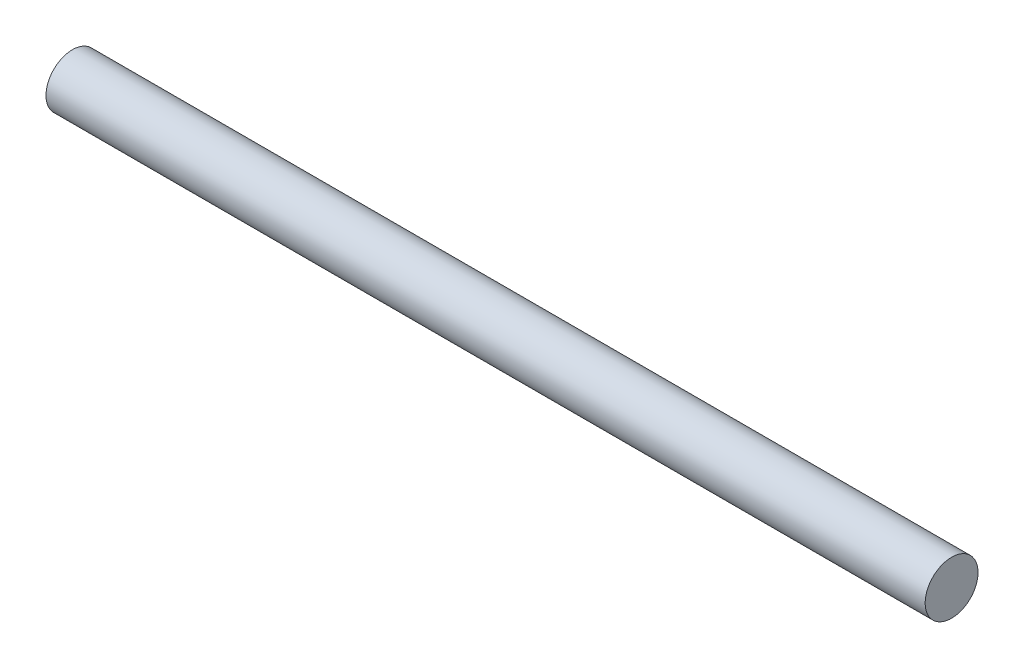
ISO-10303-21;
HEADER;
FILE_DESCRIPTION(('STEP AP214'),'2;1');
FILE_NAME('part.step','',(''),(''),'','','');
FILE_SCHEMA(('AUTOMOTIVE_DESIGN { 1 0 10303 214 1 1 1 1 }'));
ENDSEC;
DATA;
#1=APPLICATION_CONTEXT('core data for automotive mechanical design processes');
#2=APPLICATION_PROTOCOL_DEFINITION('international standard','automotive_design',2000,#1);
#3=PRODUCT_CONTEXT('',#1,'mechanical');
#4=PRODUCT('Part','Part','',(#3));
#5=PRODUCT_RELATED_PRODUCT_CATEGORY('part','',(#4));
#6=PRODUCT_DEFINITION_FORMATION('','',#4);
#7=PRODUCT_DEFINITION_CONTEXT('part definition',#1,'design');
#8=PRODUCT_DEFINITION('design','',#6,#7);
#9=PRODUCT_DEFINITION_SHAPE('','',#8);
#10=(LENGTH_UNIT() NAMED_UNIT(*) SI_UNIT(.MILLI.,.METRE.));
#11=(NAMED_UNIT(*) PLANE_ANGLE_UNIT() SI_UNIT($,.RADIAN.));
#12=(NAMED_UNIT(*) SI_UNIT($,.STERADIAN.) SOLID_ANGLE_UNIT());
#13=UNCERTAINTY_MEASURE_WITH_UNIT(LENGTH_MEASURE(1.E-05),#10,'distance_accuracy_value','');
#14=(GEOMETRIC_REPRESENTATION_CONTEXT(3) GLOBAL_UNCERTAINTY_ASSIGNED_CONTEXT((#13)) GLOBAL_UNIT_ASSIGNED_CONTEXT((#10,
#11,#12)) REPRESENTATION_CONTEXT('',''));
#15=CARTESIAN_POINT('',(0.,0.,0.));
#16=DIRECTION('',(0.,0.,1.));
#17=DIRECTION('',(1.,0.,0.));
#18=AXIS2_PLACEMENT_3D('',#15,#16,#17);
#19=CARTESIAN_POINT('',(-779.039347611489,377.335927831157,-617.65));
#20=DIRECTION('',(-1.,0.,0.));
#21=DIRECTION('',(0.,0.,1.));
#22=AXIS2_PLACEMENT_3D('',#19,#20,#21);
#23=PLANE('',#22);
#24=CARTESIAN_POINT('',(-779.039347611489,328.310927831157,-613.95));
#25=DIRECTION('',(-1.,0.,0.));
#26=DIRECTION('',(0.,0.,1.));
#27=AXIS2_PLACEMENT_3D('',#24,#25,#26);
#28=CIRCLE('',#27,36.449);
#29=CARTESIAN_POINT('',(-779.039347611489,328.310927831157,-577.501));
#30=VERTEX_POINT('',#29);
#31=EDGE_CURVE('E17',#30,#30,#28,.F.);
#32=ORIENTED_EDGE('',*,*,#31,.F.);
#33=EDGE_LOOP('',(#32));
#34=FACE_BOUND('',#33,.T.);
#35=ADVANCED_FACE('F14',(#34),#23,.T.);
#36=CARTESIAN_POINT('',(432.060652388511,377.335927831157,-617.65));
#37=DIRECTION('',(-1.,0.,0.));
#38=DIRECTION('',(0.,0.,1.));
#39=AXIS2_PLACEMENT_3D('',#36,#37,#38);
#40=PLANE('',#39);
#41=CARTESIAN_POINT('',(432.060652388511,328.310927831157,-613.95));
#42=DIRECTION('',(-1.,0.,0.));
#43=DIRECTION('',(0.,0.,1.));
#44=AXIS2_PLACEMENT_3D('',#41,#42,#43);
#45=CIRCLE('',#44,36.449);
#46=CARTESIAN_POINT('',(432.060652388511,328.310927831157,-577.501));
#47=VERTEX_POINT('',#46);
#48=EDGE_CURVE('E10',#47,#47,#45,.T.);
#49=ORIENTED_EDGE('',*,*,#48,.F.);
#50=EDGE_LOOP('',(#49));
#51=FACE_BOUND('',#50,.T.);
#52=ADVANCED_FACE('F32',(#51),#40,.F.);
#53=CARTESIAN_POINT('',(432.060652388511,328.310927831157,-613.95));
#54=DIRECTION('',(-1.,0.,0.));
#55=DIRECTION('',(0.,0.,1.));
#56=AXIS2_PLACEMENT_3D('',#53,#54,#55);
#57=CYLINDRICAL_SURFACE('',#56,36.449);
#58=ORIENTED_EDGE('',*,*,#48,.T.);
#59=EDGE_LOOP('',(#58));
#60=FACE_BOUND('',#59,.T.);
#61=ORIENTED_EDGE('',*,*,#31,.T.);
#62=EDGE_LOOP('',(#61));
#63=FACE_BOUND('',#62,.T.);
#64=ADVANCED_FACE('F29',(#60,#63),#57,.T.);
#65=CLOSED_SHELL('',(#35,#52,#64));
#66=MANIFOLD_SOLID_BREP('B1',#65);
#67=ADVANCED_BREP_SHAPE_REPRESENTATION('',(#18,#66),#14);
#68=SHAPE_DEFINITION_REPRESENTATION(#9,#67);
ENDSEC;
END-ISO-10303-21;
